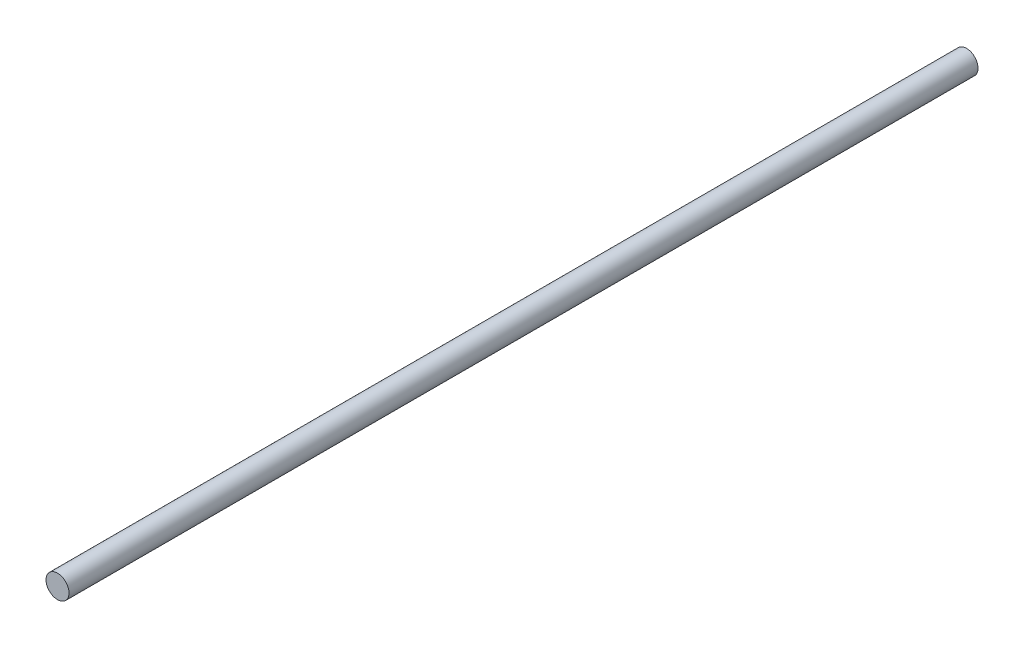
ISO-10303-21;
HEADER;
FILE_DESCRIPTION(('STEP AP214'),'2;1');
FILE_NAME('part.step','',(''),(''),'','','');
FILE_SCHEMA(('AUTOMOTIVE_DESIGN { 1 0 10303 214 1 1 1 1 }'));
ENDSEC;
DATA;
#1=APPLICATION_CONTEXT('core data for automotive mechanical design processes');
#2=APPLICATION_PROTOCOL_DEFINITION('international standard','automotive_design',2000,#1);
#3=PRODUCT_CONTEXT('',#1,'mechanical');
#4=PRODUCT('Part','Part','',(#3));
#5=PRODUCT_RELATED_PRODUCT_CATEGORY('part','',(#4));
#6=PRODUCT_DEFINITION_FORMATION('','',#4);
#7=PRODUCT_DEFINITION_CONTEXT('part definition',#1,'design');
#8=PRODUCT_DEFINITION('design','',#6,#7);
#9=PRODUCT_DEFINITION_SHAPE('','',#8);
#10=(LENGTH_UNIT() NAMED_UNIT(*) SI_UNIT(.MILLI.,.METRE.));
#11=(NAMED_UNIT(*) PLANE_ANGLE_UNIT() SI_UNIT($,.RADIAN.));
#12=(NAMED_UNIT(*) SI_UNIT($,.STERADIAN.) SOLID_ANGLE_UNIT());
#13=UNCERTAINTY_MEASURE_WITH_UNIT(LENGTH_MEASURE(1.E-05),#10,'distance_accuracy_value','');
#14=(GEOMETRIC_REPRESENTATION_CONTEXT(3) GLOBAL_UNCERTAINTY_ASSIGNED_CONTEXT((#13)) GLOBAL_UNIT_ASSIGNED_CONTEXT((#10,
#11,#12)) REPRESENTATION_CONTEXT('',''));
#15=CARTESIAN_POINT('',(0.,0.,0.));
#16=DIRECTION('',(0.,0.,1.));
#17=DIRECTION('',(1.,0.,0.));
#18=AXIS2_PLACEMENT_3D('',#15,#16,#17);
#19=CARTESIAN_POINT('',(0.,0.,790.));
#20=DIRECTION('',(0.,0.,-1.));
#21=DIRECTION('',(-1.,0.,0.));
#22=AXIS2_PLACEMENT_3D('',#19,#20,#21);
#23=CYLINDRICAL_SURFACE('',#22,10.);
#24=CARTESIAN_POINT('',(0.,0.,790.));
#25=DIRECTION('',(0.,0.,1.));
#26=DIRECTION('',(1.,0.,0.));
#27=AXIS2_PLACEMENT_3D('',#24,#25,#26);
#28=CIRCLE('',#27,10.);
#29=CARTESIAN_POINT('',(-10.,0.,790.));
#30=VERTEX_POINT('',#29);
#31=EDGE_CURVE('E10',#30,#30,#28,.T.);
#32=CARTESIAN_POINT('',(0.,0.,0.));
#33=DIRECTION('',(0.,0.,1.));
#34=DIRECTION('',(1.,0.,0.));
#35=AXIS2_PLACEMENT_3D('',#32,#33,#34);
#36=CIRCLE('',#35,10.);
#37=CARTESIAN_POINT('',(-10.,0.,-1.11022302462516E-13));
#38=VERTEX_POINT('',#37);
#39=EDGE_CURVE('E40',#38,#38,#36,.T.);
#40=CARTESIAN_POINT('',(-10.,0.,790.));
#41=CARTESIAN_POINT('',(-10.,0.,781.770833333333));
#42=CARTESIAN_POINT('',(-10.,0.,773.541666666667));
#43=CARTESIAN_POINT('',(-10.,0.,757.083333333333));
#44=CARTESIAN_POINT('',(-10.,0.,748.854166666667));
#45=CARTESIAN_POINT('',(-10.,0.,732.395833333333));
#46=CARTESIAN_POINT('',(-10.,0.,724.166666666667));
#47=CARTESIAN_POINT('',(-10.,0.,707.708333333333));
#48=CARTESIAN_POINT('',(-10.,0.,699.479166666667));
#49=CARTESIAN_POINT('',(-10.,0.,683.020833333333));
#50=CARTESIAN_POINT('',(-10.,0.,674.791666666667));
#51=CARTESIAN_POINT('',(-10.,0.,658.333333333333));
#52=CARTESIAN_POINT('',(-10.,0.,650.104166666667));
#53=CARTESIAN_POINT('',(-10.,0.,633.645833333333));
#54=CARTESIAN_POINT('',(-10.,0.,625.416666666667));
#55=CARTESIAN_POINT('',(-10.,0.,608.958333333333));
#56=CARTESIAN_POINT('',(-10.,0.,600.729166666667));
#57=CARTESIAN_POINT('',(-10.,0.,584.270833333333));
#58=CARTESIAN_POINT('',(-10.,0.,576.041666666667));
#59=CARTESIAN_POINT('',(-10.,0.,559.583333333333));
#60=CARTESIAN_POINT('',(-10.,0.,551.354166666667));
#61=CARTESIAN_POINT('',(-10.,0.,534.895833333333));
#62=CARTESIAN_POINT('',(-10.,0.,526.666666666667));
#63=CARTESIAN_POINT('',(-10.,0.,510.208333333333));
#64=CARTESIAN_POINT('',(-10.,0.,501.979166666667));
#65=CARTESIAN_POINT('',(-10.,0.,485.520833333333));
#66=CARTESIAN_POINT('',(-10.,0.,477.291666666667));
#67=CARTESIAN_POINT('',(-10.,0.,460.833333333333));
#68=CARTESIAN_POINT('',(-10.,0.,452.604166666667));
#69=CARTESIAN_POINT('',(-10.,0.,436.145833333333));
#70=CARTESIAN_POINT('',(-10.,0.,427.916666666667));
#71=CARTESIAN_POINT('',(-10.,0.,411.458333333333));
#72=CARTESIAN_POINT('',(-10.,0.,403.229166666667));
#73=CARTESIAN_POINT('',(-10.,0.,386.770833333333));
#74=CARTESIAN_POINT('',(-10.,0.,378.541666666667));
#75=CARTESIAN_POINT('',(-10.,0.,362.083333333333));
#76=CARTESIAN_POINT('',(-10.,0.,353.854166666667));
#77=CARTESIAN_POINT('',(-10.,0.,337.395833333333));
#78=CARTESIAN_POINT('',(-10.,0.,329.166666666667));
#79=CARTESIAN_POINT('',(-10.,0.,312.708333333333));
#80=CARTESIAN_POINT('',(-10.,0.,304.479166666667));
#81=CARTESIAN_POINT('',(-10.,0.,288.020833333333));
#82=CARTESIAN_POINT('',(-10.,0.,279.791666666667));
#83=CARTESIAN_POINT('',(-10.,0.,263.333333333333));
#84=CARTESIAN_POINT('',(-10.,0.,255.104166666667));
#85=CARTESIAN_POINT('',(-10.,0.,238.645833333333));
#86=CARTESIAN_POINT('',(-10.,0.,230.416666666667));
#87=CARTESIAN_POINT('',(-10.,0.,213.958333333333));
#88=CARTESIAN_POINT('',(-10.,0.,205.729166666667));
#89=CARTESIAN_POINT('',(-10.,0.,189.270833333333));
#90=CARTESIAN_POINT('',(-10.,0.,181.041666666667));
#91=CARTESIAN_POINT('',(-10.,0.,164.583333333333));
#92=CARTESIAN_POINT('',(-10.,0.,156.354166666667));
#93=CARTESIAN_POINT('',(-10.,0.,139.895833333333));
#94=CARTESIAN_POINT('',(-10.,0.,131.666666666667));
#95=CARTESIAN_POINT('',(-10.,0.,115.208333333333));
#96=CARTESIAN_POINT('',(-10.,0.,106.979166666667));
#97=CARTESIAN_POINT('',(-10.,0.,90.5208333333332));
#98=CARTESIAN_POINT('',(-10.,0.,82.2916666666666));
#99=CARTESIAN_POINT('',(-10.,0.,65.8333333333333));
#100=CARTESIAN_POINT('',(-10.,0.,57.6041666666666));
#101=CARTESIAN_POINT('',(-10.,0.,41.1458333333333));
#102=CARTESIAN_POINT('',(-10.,0.,32.9166666666666));
#103=CARTESIAN_POINT('',(-10.,0.,16.4583333333332));
#104=CARTESIAN_POINT('',(-10.,0.,8.22916666666655));
#105=CARTESIAN_POINT('',(-10.,0.,-1.11022302462516E-13));
#106=B_SPLINE_CURVE_WITH_KNOTS('',3,(#40,#41,#42,#43,#44,#45,#46,#47,#48,#49,#50,#51,#52,#53,
#54,#55,#56,#57,#58,#59,#60,#61,#62,#63,#64,#65,#66,#67,#68,#69,#70,#71,#72,#73,#74,#75,#76,#77,
#78,#79,#80,#81,#82,#83,#84,#85,#86,#87,#88,#89,#90,#91,#92,#93,#94,#95,#96,#97,#98,#99,#100,
#101,#102,#103,#104,#105),.UNSPECIFIED.,.F.,.F.,(4,2,2,2,2,2,2,2,2,2,2,2,2,2,2,2,2,2,2,2,2,2,2,
2,2,2,2,2,2,2,2,2,4),(0.,24.6875,49.3749999999999,74.0624999999999,98.75,123.4375,148.125,
172.8125,197.5,222.1875,246.875,271.5625,296.25,320.9375,345.625,370.3125,395.,419.6875,444.375,
469.0625,493.75,518.4375,543.125,567.8125,592.5,617.1875,641.875,666.5625,691.25,715.9375,
740.625,765.3125,790.),.UNSPECIFIED.);
#107=EDGE_CURVE('BSEAM37',#30,#38,#106,.T.);
#108=ORIENTED_EDGE('',*,*,#31,.F.);
#109=ORIENTED_EDGE('',*,*,#39,.T.);
#110=ORIENTED_EDGE('',*,*,#107,.T.);
#111=ORIENTED_EDGE('',*,*,#107,.F.);
#112=EDGE_LOOP('',(#108,#110,#109,#111));
#113=FACE_BOUND('',#112,.T.);
#114=ADVANCED_FACE('F37',(#113),#23,.T.);
#115=CARTESIAN_POINT('',(0.,0.,790.));
#116=DIRECTION('',(0.,0.,1.));
#117=DIRECTION('',(1.,0.,0.));
#118=AXIS2_PLACEMENT_3D('',#115,#116,#117);
#119=PLANE('',#118);
#120=ORIENTED_EDGE('',*,*,#31,.T.);
#121=EDGE_LOOP('',(#120));
#122=FACE_BOUND('',#121,.T.);
#123=ADVANCED_FACE('F54',(#122),#119,.T.);
#124=CARTESIAN_POINT('',(0.,0.,0.));
#125=DIRECTION('',(0.,0.,1.));
#126=DIRECTION('',(1.,0.,0.));
#127=AXIS2_PLACEMENT_3D('',#124,#125,#126);
#128=PLANE('',#127);
#129=ORIENTED_EDGE('',*,*,#39,.F.);
#130=EDGE_LOOP('',(#129));
#131=FACE_BOUND('',#130,.T.);
#132=ADVANCED_FACE('F52',(#131),#128,.F.);
#133=CLOSED_SHELL('',(#114,#123,#132));
#134=MANIFOLD_SOLID_BREP('B2',#133);
#135=ADVANCED_BREP_SHAPE_REPRESENTATION('',(#18,#134),#14);
#136=SHAPE_DEFINITION_REPRESENTATION(#9,#135);
ENDSEC;
END-ISO-10303-21;
